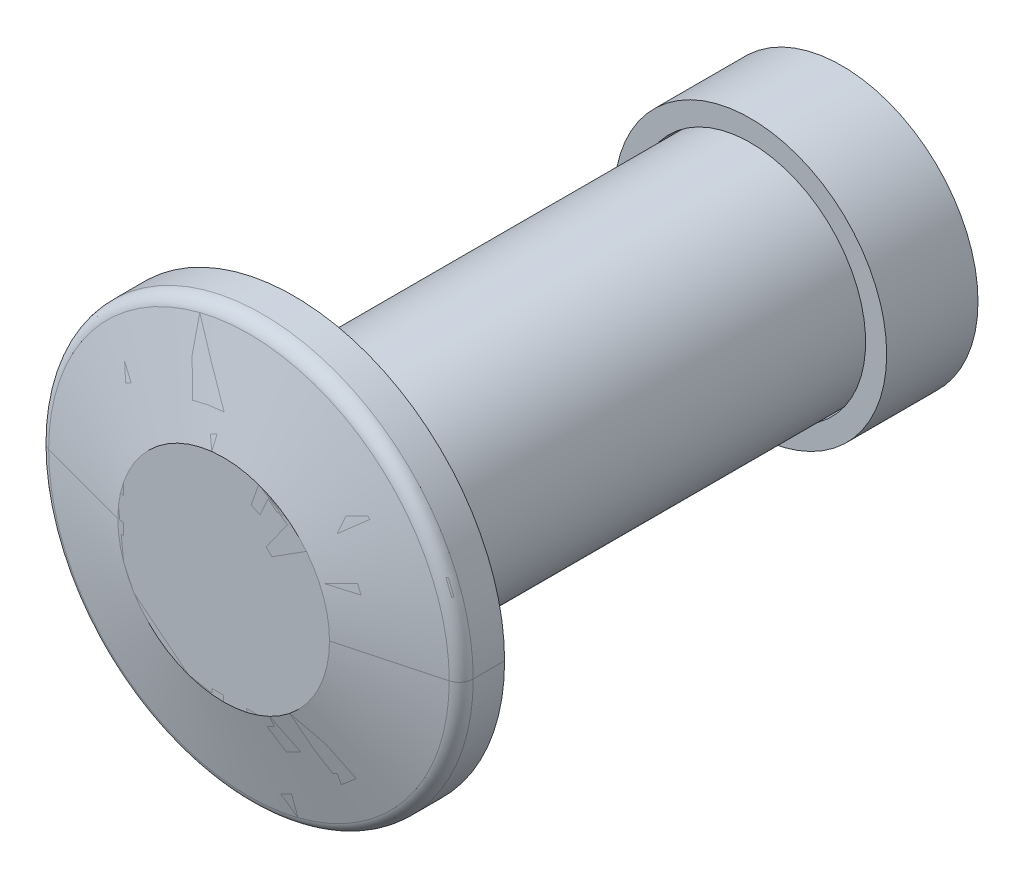
ISO-10303-21;
HEADER;
FILE_DESCRIPTION(('STEP AP214'),'2;1');
FILE_NAME('part.step','',(''),(''),'','','');
FILE_SCHEMA(('AUTOMOTIVE_DESIGN { 1 0 10303 214 1 1 1 1 }'));
ENDSEC;
DATA;
#1=APPLICATION_CONTEXT('core data for automotive mechanical design processes');
#2=APPLICATION_PROTOCOL_DEFINITION('international standard','automotive_design',2000,#1);
#3=PRODUCT_CONTEXT('',#1,'mechanical');
#4=PRODUCT('Part','Part','',(#3));
#5=PRODUCT_RELATED_PRODUCT_CATEGORY('part','',(#4));
#6=PRODUCT_DEFINITION_FORMATION('','',#4);
#7=PRODUCT_DEFINITION_CONTEXT('part definition',#1,'design');
#8=PRODUCT_DEFINITION('design','',#6,#7);
#9=PRODUCT_DEFINITION_SHAPE('','',#8);
#10=(LENGTH_UNIT() NAMED_UNIT(*) SI_UNIT(.MILLI.,.METRE.));
#11=(NAMED_UNIT(*) PLANE_ANGLE_UNIT() SI_UNIT($,.RADIAN.));
#12=(NAMED_UNIT(*) SI_UNIT($,.STERADIAN.) SOLID_ANGLE_UNIT());
#13=UNCERTAINTY_MEASURE_WITH_UNIT(LENGTH_MEASURE(1.E-05),#10,'distance_accuracy_value','');
#14=(GEOMETRIC_REPRESENTATION_CONTEXT(3) GLOBAL_UNCERTAINTY_ASSIGNED_CONTEXT((#13)) GLOBAL_UNIT_ASSIGNED_CONTEXT((#10,
#11,#12)) REPRESENTATION_CONTEXT('',''));
#15=CARTESIAN_POINT('',(0.,0.,0.));
#16=DIRECTION('',(0.,0.,1.));
#17=DIRECTION('',(1.,0.,0.));
#18=AXIS2_PLACEMENT_3D('',#15,#16,#17);
#19=CARTESIAN_POINT('',(0.,0.,-37.5));
#20=DIRECTION('',(0.,0.,-1.));
#21=DIRECTION('',(-1.,0.,0.));
#22=AXIS2_PLACEMENT_3D('',#19,#20,#21);
#23=CYLINDRICAL_SURFACE('',#22,9.7);
#24=CARTESIAN_POINT('',(0.,0.,-37.5));
#25=DIRECTION('',(0.,0.,-1.));
#26=DIRECTION('',(-1.,0.,0.));
#27=AXIS2_PLACEMENT_3D('',#24,#25,#26);
#28=CIRCLE('',#27,9.7);
#29=CARTESIAN_POINT('',(-9.7,0.,-37.5));
#30=VERTEX_POINT('',#29);
#31=EDGE_CURVE('P0_E11',#30,#30,#28,.T.);
#32=ORIENTED_EDGE('',*,*,#31,.T.);
#33=EDGE_LOOP('',(#32));
#34=FACE_BOUND('',#33,.T.);
#35=CARTESIAN_POINT('',(0.,0.,-44.));
#36=DIRECTION('',(0.,0.,-1.));
#37=DIRECTION('',(-1.,0.,0.));
#38=AXIS2_PLACEMENT_3D('',#35,#36,#37);
#39=CIRCLE('',#38,9.7);
#40=CARTESIAN_POINT('',(-9.7,0.,-44.));
#41=VERTEX_POINT('',#40);
#42=EDGE_CURVE('P0_E72',#41,#41,#39,.T.);
#43=ORIENTED_EDGE('',*,*,#42,.F.);
#44=EDGE_LOOP('',(#43));
#45=FACE_BOUND('',#44,.T.);
#46=ADVANCED_FACE('P0_F57',(#34,#45),#23,.T.);
#47=CARTESIAN_POINT('',(0.,0.,-37.5));
#48=DIRECTION('',(0.,0.,-1.));
#49=DIRECTION('',(-1.,0.,0.));
#50=AXIS2_PLACEMENT_3D('',#47,#48,#49);
#51=PLANE('',#50);
#52=CARTESIAN_POINT('',(0.,0.,-37.5));
#53=DIRECTION('',(0.,0.,-1.));
#54=DIRECTION('',(-1.,0.,0.));
#55=AXIS2_PLACEMENT_3D('',#52,#53,#54);
#56=CIRCLE('',#55,8.2);
#57=CARTESIAN_POINT('',(-8.2,0.,-37.5));
#58=VERTEX_POINT('',#57);
#59=EDGE_CURVE('P0_E63',#58,#58,#56,.T.);
#60=ORIENTED_EDGE('',*,*,#59,.T.);
#61=EDGE_LOOP('',(#60));
#62=FACE_BOUND('',#61,.T.);
#63=ORIENTED_EDGE('',*,*,#31,.F.);
#64=EDGE_LOOP('',(#63));
#65=FACE_BOUND('',#64,.T.);
#66=ADVANCED_FACE('P0_F108',(#62,#65),#51,.F.);
#67=CARTESIAN_POINT('',(0.,0.,-37.5));
#68=DIRECTION('',(0.,0.,-1.));
#69=DIRECTION('',(-1.,0.,0.));
#70=AXIS2_PLACEMENT_3D('',#67,#68,#69);
#71=CYLINDRICAL_SURFACE('',#70,8.2);
#72=ORIENTED_EDGE('',*,*,#59,.F.);
#73=EDGE_LOOP('',(#72));
#74=FACE_BOUND('',#73,.T.);
#75=CARTESIAN_POINT('',(0.,0.,-42.5));
#76=DIRECTION('',(0.,0.,-1.));
#77=DIRECTION('',(-1.,0.,0.));
#78=AXIS2_PLACEMENT_3D('',#75,#76,#77);
#79=CIRCLE('',#78,8.2);
#80=CARTESIAN_POINT('',(-8.2,0.,-42.5));
#81=VERTEX_POINT('',#80);
#82=EDGE_CURVE('P0_E67',#81,#81,#79,.T.);
#83=ORIENTED_EDGE('',*,*,#82,.T.);
#84=EDGE_LOOP('',(#83));
#85=FACE_BOUND('',#84,.T.);
#86=ADVANCED_FACE('P0_F112',(#74,#85),#71,.F.);
#87=CARTESIAN_POINT('',(0.,0.,-42.5));
#88=DIRECTION('',(0.,0.,-1.));
#89=DIRECTION('',(-1.,0.,0.));
#90=AXIS2_PLACEMENT_3D('',#87,#88,#89);
#91=PLANE('',#90);
#92=CARTESIAN_POINT('',(0.,0.,-42.5));
#93=DIRECTION('',(0.,0.,-1.));
#94=DIRECTION('',(-1.,0.,0.));
#95=AXIS2_PLACEMENT_3D('',#92,#93,#94);
#96=CIRCLE('',#95,3.6);
#97=CARTESIAN_POINT('',(-3.6,0.,-42.5));
#98=VERTEX_POINT('',#97);
#99=EDGE_CURVE('P0_E80',#98,#98,#96,.T.);
#100=ORIENTED_EDGE('',*,*,#99,.T.);
#101=EDGE_LOOP('',(#100));
#102=FACE_BOUND('',#101,.T.);
#103=CARTESIAN_POINT('',(0.,-5.9,-42.5));
#104=DIRECTION('',(0.,0.,-1.));
#105=DIRECTION('',(-1.,0.,0.));
#106=AXIS2_PLACEMENT_3D('',#103,#104,#105);
#107=CIRCLE('',#106,1.5);
#108=CARTESIAN_POINT('',(-1.5,-5.9,-42.5));
#109=VERTEX_POINT('',#108);
#110=EDGE_CURVE('P0_E76',#109,#109,#107,.T.);
#111=ORIENTED_EDGE('',*,*,#110,.T.);
#112=EDGE_LOOP('',(#111));
#113=FACE_BOUND('',#112,.T.);
#114=ORIENTED_EDGE('',*,*,#82,.F.);
#115=EDGE_LOOP('',(#114));
#116=FACE_BOUND('',#115,.T.);
#117=ADVANCED_FACE('P0_F89',(#102,#113,#116),#91,.F.);
#118=CARTESIAN_POINT('',(0.,0.,-44.));
#119=DIRECTION('',(0.,0.,-1.));
#120=DIRECTION('',(-1.,0.,0.));
#121=AXIS2_PLACEMENT_3D('',#118,#119,#120);
#122=PLANE('',#121);
#123=CARTESIAN_POINT('',(0.,-5.9,-44.));
#124=DIRECTION('',(0.,0.,-1.));
#125=DIRECTION('',(-1.,0.,0.));
#126=AXIS2_PLACEMENT_3D('',#123,#124,#125);
#127=CIRCLE('',#126,1.5);
#128=CARTESIAN_POINT('',(-1.5,-5.9,-44.));
#129=VERTEX_POINT('',#128);
#130=EDGE_CURVE('P0_E83',#129,#129,#127,.T.);
#131=ORIENTED_EDGE('',*,*,#130,.F.);
#132=EDGE_LOOP('',(#131));
#133=FACE_BOUND('',#132,.T.);
#134=CARTESIAN_POINT('',(0.,0.,-44.));
#135=DIRECTION('',(0.,0.,-1.));
#136=DIRECTION('',(-1.,0.,0.));
#137=AXIS2_PLACEMENT_3D('',#134,#135,#136);
#138=CIRCLE('',#137,3.6);
#139=CARTESIAN_POINT('',(-3.6,0.,-44.));
#140=VERTEX_POINT('',#139);
#141=EDGE_CURVE('P0_E77',#140,#140,#138,.T.);
#142=ORIENTED_EDGE('',*,*,#141,.F.);
#143=EDGE_LOOP('',(#142));
#144=FACE_BOUND('',#143,.T.);
#145=ORIENTED_EDGE('',*,*,#42,.T.);
#146=EDGE_LOOP('',(#145));
#147=FACE_BOUND('',#146,.T.);
#148=ADVANCED_FACE('P0_F99',(#133,#144,#147),#122,.T.);
#149=CARTESIAN_POINT('',(0.,0.,-42.5));
#150=DIRECTION('',(0.,0.,-1.));
#151=DIRECTION('',(-1.,0.,0.));
#152=AXIS2_PLACEMENT_3D('',#149,#150,#151);
#153=CYLINDRICAL_SURFACE('',#152,3.6);
#154=ORIENTED_EDGE('',*,*,#99,.F.);
#155=EDGE_LOOP('',(#154));
#156=FACE_BOUND('',#155,.T.);
#157=ORIENTED_EDGE('',*,*,#141,.T.);
#158=EDGE_LOOP('',(#157));
#159=FACE_BOUND('',#158,.T.);
#160=ADVANCED_FACE('P0_F95',(#156,#159),#153,.F.);
#161=CARTESIAN_POINT('',(0.,-5.9,-42.5));
#162=DIRECTION('',(0.,0.,-1.));
#163=DIRECTION('',(-1.,0.,0.));
#164=AXIS2_PLACEMENT_3D('',#161,#162,#163);
#165=CYLINDRICAL_SURFACE('',#164,1.5);
#166=ORIENTED_EDGE('',*,*,#110,.F.);
#167=EDGE_LOOP('',(#166));
#168=FACE_BOUND('',#167,.T.);
#169=ORIENTED_EDGE('',*,*,#130,.T.);
#170=EDGE_LOOP('',(#169));
#171=FACE_BOUND('',#170,.T.);
#172=ADVANCED_FACE('P0_F92',(#168,#171),#165,.F.);
#173=CLOSED_SHELL('',(#46,#66,#86,#117,#148,#160,#172));
#174=MANIFOLD_SOLID_BREP('P0_B2',#173);
#175=CARTESIAN_POINT('',(0.,0.,-42.5));
#176=DIRECTION('',(0.,0.,-1.));
#177=DIRECTION('',(-1.,0.,0.));
#178=AXIS2_PLACEMENT_3D('',#175,#176,#177);
#179=PLANE('',#178);
#180=CARTESIAN_POINT('',(0.,0.,-42.5));
#181=DIRECTION('',(0.,0.,-1.));
#182=DIRECTION('',(-1.,0.,0.));
#183=AXIS2_PLACEMENT_3D('',#180,#181,#182);
#184=CIRCLE('',#183,8.1);
#185=CARTESIAN_POINT('',(-8.1,0.,-42.5));
#186=VERTEX_POINT('',#185);
#187=EDGE_CURVE('P0_E56',#186,#186,#184,.T.);
#188=ORIENTED_EDGE('',*,*,#187,.T.);
#189=EDGE_LOOP('',(#188));
#190=FACE_BOUND('',#189,.T.);
#191=CARTESIAN_POINT('',(0.,0.,-42.5));
#192=DIRECTION('',(0.,0.,-1.));
#193=DIRECTION('',(-1.,0.,0.));
#194=AXIS2_PLACEMENT_3D('',#191,#192,#193);
#195=CIRCLE('',#194,7.1);
#196=CARTESIAN_POINT('',(-7.1,0.,-42.5));
#197=VERTEX_POINT('',#196);
#198=EDGE_CURVE('P0_E192',#197,#197,#195,.T.);
#199=ORIENTED_EDGE('',*,*,#198,.F.);
#200=EDGE_LOOP('',(#199));
#201=FACE_BOUND('',#200,.T.);
#202=ADVANCED_FACE('P0_F181',(#190,#201),#179,.T.);
#203=CARTESIAN_POINT('',(0.,0.,-2.5));
#204=DIRECTION('',(0.,0.,-1.));
#205=DIRECTION('',(-1.,0.,0.));
#206=AXIS2_PLACEMENT_3D('',#203,#204,#205);
#207=PLANE('',#206);
#208=CARTESIAN_POINT('',(0.,0.,-2.5));
#209=DIRECTION('',(0.,0.,-1.));
#210=DIRECTION('',(-1.,0.,0.));
#211=AXIS2_PLACEMENT_3D('',#208,#209,#210);
#212=CIRCLE('',#211,8.1);
#213=CARTESIAN_POINT('',(-8.1,0.,-2.5));
#214=VERTEX_POINT('',#213);
#215=EDGE_CURVE('P0_E185',#214,#214,#212,.T.);
#216=ORIENTED_EDGE('',*,*,#215,.F.);
#217=EDGE_LOOP('',(#216));
#218=FACE_BOUND('',#217,.T.);
#219=CARTESIAN_POINT('',(0.,0.,-2.5));
#220=DIRECTION('',(0.,0.,-1.));
#221=DIRECTION('',(-1.,0.,0.));
#222=AXIS2_PLACEMENT_3D('',#219,#220,#221);
#223=CIRCLE('',#222,7.1);
#224=CARTESIAN_POINT('',(-7.1,0.,-2.5));
#225=VERTEX_POINT('',#224);
#226=EDGE_CURVE('P0_E194',#225,#225,#223,.T.);
#227=ORIENTED_EDGE('',*,*,#226,.T.);
#228=EDGE_LOOP('',(#227));
#229=FACE_BOUND('',#228,.T.);
#230=ADVANCED_FACE('P0_F203',(#218,#229),#207,.F.);
#231=CARTESIAN_POINT('',(0.,0.,-42.5));
#232=DIRECTION('',(0.,0.,1.));
#233=DIRECTION('',(1.,0.,0.));
#234=AXIS2_PLACEMENT_3D('',#231,#232,#233);
#235=CYLINDRICAL_SURFACE('',#234,8.1);
#236=ORIENTED_EDGE('',*,*,#215,.T.);
#237=EDGE_LOOP('',(#236));
#238=FACE_BOUND('',#237,.T.);
#239=ORIENTED_EDGE('',*,*,#187,.F.);
#240=EDGE_LOOP('',(#239));
#241=FACE_BOUND('',#240,.T.);
#242=ADVANCED_FACE('P0_F183',(#238,#241),#235,.T.);
#243=CARTESIAN_POINT('',(0.,0.,-42.5));
#244=DIRECTION('',(0.,0.,1.));
#245=DIRECTION('',(1.,0.,0.));
#246=AXIS2_PLACEMENT_3D('',#243,#244,#245);
#247=CYLINDRICAL_SURFACE('',#246,7.1);
#248=ORIENTED_EDGE('',*,*,#226,.F.);
#249=EDGE_LOOP('',(#248));
#250=FACE_BOUND('',#249,.T.);
#251=ORIENTED_EDGE('',*,*,#198,.T.);
#252=EDGE_LOOP('',(#251));
#253=FACE_BOUND('',#252,.T.);
#254=ADVANCED_FACE('P0_F200',(#250,#253),#247,.F.);
#255=CLOSED_SHELL('',(#202,#230,#242,#254));
#256=MANIFOLD_SOLID_BREP('P0_B6',#255);
#257=CARTESIAN_POINT('',(0.,0.,-2.76756770947729));
#258=DIRECTION('',(0.,0.,-1.));
#259=DIRECTION('',(-1.,0.,0.));
#260=AXIS2_PLACEMENT_3D('',#257,#258,#259);
#261=TOROIDAL_SURFACE('',#260,14.,1.);
#262=CARTESIAN_POINT('',(0.,0.,-1.80164188318823));
#263=DIRECTION('',(0.,0.,-1.));
#264=DIRECTION('',(-1.,0.,0.));
#265=AXIS2_PLACEMENT_3D('',#262,#263,#264);
#266=CIRCLE('',#265,14.2588190451025);
#267=CARTESIAN_POINT('',(-14.2588190451025,0.,-1.80164188318823));
#268=VERTEX_POINT('',#267);
#269=CARTESIAN_POINT('',(14.2588190451025,0.,-1.80164188318823));
#270=VERTEX_POINT('',#269);
#271=EDGE_CURVE('P0_E179',#268,#270,#266,.T.);
#272=ORIENTED_EDGE('',*,*,#271,.T.);
#273=CARTESIAN_POINT('',(14.,0.,-2.76756770947729));
#274=DIRECTION('',(0.,1.,0.));
#275=DIRECTION('',(-1.,0.,0.));
#276=AXIS2_PLACEMENT_3D('',#273,#274,#275);
#277=CIRCLE('',#276,1.);
#278=CARTESIAN_POINT('',(15.,0.,-2.76756770947731));
#279=VERTEX_POINT('',#278);
#280=EDGE_CURVE('P0_E259',#270,#279,#277,.T.);
#281=ORIENTED_EDGE('',*,*,#280,.T.);
#282=CARTESIAN_POINT('',(0.,0.,-2.76756770947731));
#283=DIRECTION('',(0.,0.,-1.));
#284=DIRECTION('',(-1.,0.,0.));
#285=AXIS2_PLACEMENT_3D('',#282,#283,#284);
#286=CIRCLE('',#285,15.);
#287=CARTESIAN_POINT('',(-15.,0.,-2.76756770947731));
#288=VERTEX_POINT('',#287);
#289=EDGE_CURVE('P0_E343',#288,#279,#286,.T.);
#290=ORIENTED_EDGE('',*,*,#289,.F.);
#291=CARTESIAN_POINT('',(-14.,0.,-2.76756770947729));
#292=DIRECTION('',(0.,-1.,0.));
#293=DIRECTION('',(0.,0.,-1.));
#294=AXIS2_PLACEMENT_3D('',#291,#292,#293);
#295=CIRCLE('',#294,1.);
#296=EDGE_CURVE('P0_E386',#268,#288,#295,.T.);
#297=ORIENTED_EDGE('',*,*,#296,.F.);
#298=EDGE_LOOP('',(#272,#281,#290,#297));
#299=FACE_BOUND('',#298,.T.);
#300=ADVANCED_FACE('P0_F248',(#299),#261,.T.);
#301=CARTESIAN_POINT('',(0.,0.,0.));
#302=DIRECTION('',(0.,0.,-1.));
#303=DIRECTION('',(-1.,0.,0.));
#304=AXIS2_PLACEMENT_3D('',#301,#302,#303);
#305=CONICAL_SURFACE('',#304,7.535,1.30899693899575);
#306=CARTESIAN_POINT('',(0.,0.,0.));
#307=DIRECTION('',(0.,0.,-1.));
#308=DIRECTION('',(-1.,0.,0.));
#309=AXIS2_PLACEMENT_3D('',#306,#307,#308);
#310=CIRCLE('',#309,7.535);
#311=CARTESIAN_POINT('',(-7.535,0.,0.));
#312=VERTEX_POINT('',#311);
#313=CARTESIAN_POINT('',(7.535,0.,0.));
#314=VERTEX_POINT('',#313);
#315=EDGE_CURVE('P0_E389',#312,#314,#310,.T.);
#316=ORIENTED_EDGE('',*,*,#315,.T.);
#317=DIRECTION('',(0.965925826289068,0.,-0.258819045102522));
#318=VECTOR('',#317,1.);
#319=CARTESIAN_POINT('',(7.535,0.,0.));
#320=LINE('',#319,#318);
#321=EDGE_CURVE('P0_E272',#314,#270,#320,.T.);
#322=ORIENTED_EDGE('',*,*,#321,.T.);
#323=ORIENTED_EDGE('',*,*,#271,.F.);
#324=DIRECTION('',(-0.965925826289068,0.,-0.258819045102522));
#325=VECTOR('',#324,1.);
#326=CARTESIAN_POINT('',(-7.535,0.,0.));
#327=LINE('',#326,#325);
#328=EDGE_CURVE('P0_E373',#312,#268,#327,.T.);
#329=ORIENTED_EDGE('',*,*,#328,.F.);
#330=EDGE_LOOP('',(#316,#322,#323,#329));
#331=FACE_BOUND('',#330,.T.);
#332=ADVANCED_FACE('P0_F468',(#331),#305,.T.);
#333=CARTESIAN_POINT('',(0.,0.,-2.8));
#334=DIRECTION('',(0.,0.,-1.));
#335=DIRECTION('',(-1.,0.,0.));
#336=AXIS2_PLACEMENT_3D('',#333,#334,#335);
#337=TOROIDAL_SURFACE('',#336,8.3,0.3);
#338=CARTESIAN_POINT('',(0.,0.,-2.5));
#339=DIRECTION('',(0.,0.,-1.));
#340=DIRECTION('',(-1.,0.,0.));
#341=AXIS2_PLACEMENT_3D('',#338,#339,#340);
#342=CIRCLE('',#341,8.3);
#343=CARTESIAN_POINT('',(8.3,0.,-2.5));
#344=VERTEX_POINT('',#343);
#345=CARTESIAN_POINT('',(-8.3,0.,-2.5));
#346=VERTEX_POINT('',#345);
#347=EDGE_CURVE('P0_E310',#344,#346,#342,.T.);
#348=ORIENTED_EDGE('',*,*,#347,.F.);
#349=CARTESIAN_POINT('',(8.3,0.,-2.8));
#350=DIRECTION('',(0.,1.,0.));
#351=DIRECTION('',(-1.,0.,0.));
#352=AXIS2_PLACEMENT_3D('',#349,#350,#351);
#353=CIRCLE('',#352,0.3);
#354=CARTESIAN_POINT('',(8.6,0.,-2.8));
#355=VERTEX_POINT('',#354);
#356=EDGE_CURVE('P0_E393',#344,#355,#353,.T.);
#357=ORIENTED_EDGE('',*,*,#356,.T.);
#358=CARTESIAN_POINT('',(0.,0.,-2.8));
#359=DIRECTION('',(0.,0.,-1.));
#360=DIRECTION('',(-1.,0.,0.));
#361=AXIS2_PLACEMENT_3D('',#358,#359,#360);
#362=CIRCLE('',#361,8.6);
#363=CARTESIAN_POINT('',(-8.6,0.,-2.8));
#364=VERTEX_POINT('',#363);
#365=EDGE_CURVE('P0_E367',#355,#364,#362,.T.);
#366=ORIENTED_EDGE('',*,*,#365,.T.);
#367=CARTESIAN_POINT('',(-8.3,0.,-2.8));
#368=DIRECTION('',(0.,-1.,0.));
#369=DIRECTION('',(0.,0.,-1.));
#370=AXIS2_PLACEMENT_3D('',#367,#368,#369);
#371=CIRCLE('',#370,0.3);
#372=EDGE_CURVE('P0_E299',#346,#364,#371,.T.);
#373=ORIENTED_EDGE('',*,*,#372,.F.);
#374=EDGE_LOOP('',(#348,#357,#366,#373));
#375=FACE_BOUND('',#374,.T.);
#376=ADVANCED_FACE('P0_F417',(#375),#337,.F.);
#377=CARTESIAN_POINT('',(0.,0.,0.));
#378=DIRECTION('',(0.,0.,-1.));
#379=DIRECTION('',(-1.,0.,0.));
#380=AXIS2_PLACEMENT_3D('',#377,#378,#379);
#381=CYLINDRICAL_SURFACE('',#380,8.6);
#382=ORIENTED_EDGE('',*,*,#365,.F.);
#383=DIRECTION('',(0.,0.,-1.));
#384=VECTOR('',#383,1.);
#385=CARTESIAN_POINT('',(8.6,0.,0.));
#386=LINE('',#385,#384);
#387=CARTESIAN_POINT('',(8.6,0.,-5.));
#388=VERTEX_POINT('',#387);
#389=EDGE_CURVE('P0_E364',#355,#388,#386,.T.);
#390=ORIENTED_EDGE('',*,*,#389,.T.);
#391=CARTESIAN_POINT('',(0.,0.,-5.));
#392=DIRECTION('',(0.,0.,-1.));
#393=DIRECTION('',(-1.,0.,0.));
#394=AXIS2_PLACEMENT_3D('',#391,#392,#393);
#395=CIRCLE('',#394,8.6);
#396=CARTESIAN_POINT('',(-8.6,0.,-5.));
#397=VERTEX_POINT('',#396);
#398=EDGE_CURVE('P0_E363',#388,#397,#395,.T.);
#399=ORIENTED_EDGE('',*,*,#398,.T.);
#400=DIRECTION('',(0.,0.,-1.));
#401=VECTOR('',#400,1.);
#402=CARTESIAN_POINT('',(-8.6,0.,0.));
#403=LINE('',#402,#401);
#404=EDGE_CURVE('P0_E352',#364,#397,#403,.T.);
#405=ORIENTED_EDGE('',*,*,#404,.F.);
#406=EDGE_LOOP('',(#382,#390,#399,#405));
#407=FACE_BOUND('',#406,.T.);
#408=ADVANCED_FACE('P0_F250',(#407),#381,.F.);
#409=CARTESIAN_POINT('',(0.,0.,0.));
#410=DIRECTION('',(0.,0.,-1.));
#411=DIRECTION('',(-1.,0.,0.));
#412=AXIS2_PLACEMENT_3D('',#409,#410,#411);
#413=CYLINDRICAL_SURFACE('',#412,15.);
#414=ORIENTED_EDGE('',*,*,#289,.T.);
#415=DIRECTION('',(0.,0.,-1.));
#416=VECTOR('',#415,1.);
#417=CARTESIAN_POINT('',(15.,0.,0.));
#418=LINE('',#417,#416);
#419=CARTESIAN_POINT('',(15.,0.,-5.));
#420=VERTEX_POINT('',#419);
#421=EDGE_CURVE('P0_E340',#279,#420,#418,.T.);
#422=ORIENTED_EDGE('',*,*,#421,.T.);
#423=CARTESIAN_POINT('',(0.,0.,-5.));
#424=DIRECTION('',(0.,0.,-1.));
#425=DIRECTION('',(-1.,0.,0.));
#426=AXIS2_PLACEMENT_3D('',#423,#424,#425);
#427=CIRCLE('',#426,15.);
#428=CARTESIAN_POINT('',(-15.,0.,-5.));
#429=VERTEX_POINT('',#428);
#430=EDGE_CURVE('P0_E326',#429,#420,#427,.T.);
#431=ORIENTED_EDGE('',*,*,#430,.F.);
#432=DIRECTION('',(0.,0.,-1.));
#433=VECTOR('',#432,1.);
#434=CARTESIAN_POINT('',(-15.,0.,0.));
#435=LINE('',#434,#433);
#436=EDGE_CURVE('P0_E337',#288,#429,#435,.T.);
#437=ORIENTED_EDGE('',*,*,#436,.F.);
#438=EDGE_LOOP('',(#414,#422,#431,#437));
#439=FACE_BOUND('',#438,.T.);
#440=ADVANCED_FACE('P0_F341',(#439),#413,.T.);
#441=CARTESIAN_POINT('',(0.,0.,0.));
#442=DIRECTION('',(0.,0.,-1.));
#443=DIRECTION('',(-1.,0.,0.));
#444=AXIS2_PLACEMENT_3D('',#441,#442,#443);
#445=CYLINDRICAL_SURFACE('',#444,15.);
#446=ORIENTED_EDGE('',*,*,#421,.F.);
#447=CARTESIAN_POINT('',(0.,0.,-2.76756770947731));
#448=DIRECTION('',(0.,0.,-1.));
#449=DIRECTION('',(-1.,0.,0.));
#450=AXIS2_PLACEMENT_3D('',#447,#448,#449);
#451=CIRCLE('',#450,15.);
#452=EDGE_CURVE('P0_E348',#279,#288,#451,.T.);
#453=ORIENTED_EDGE('',*,*,#452,.T.);
#454=ORIENTED_EDGE('',*,*,#436,.T.);
#455=CARTESIAN_POINT('',(0.,0.,-5.));
#456=DIRECTION('',(0.,0.,-1.));
#457=DIRECTION('',(-1.,0.,0.));
#458=AXIS2_PLACEMENT_3D('',#455,#456,#457);
#459=CIRCLE('',#458,15.);
#460=EDGE_CURVE('P0_E335',#420,#429,#459,.T.);
#461=ORIENTED_EDGE('',*,*,#460,.F.);
#462=EDGE_LOOP('',(#446,#453,#454,#461));
#463=FACE_BOUND('',#462,.T.);
#464=ADVANCED_FACE('P0_F350',(#463),#445,.T.);
#465=CARTESIAN_POINT('',(8.6,0.,-5.));
#466=DIRECTION('',(0.,0.,1.));
#467=DIRECTION('',(1.,0.,0.));
#468=AXIS2_PLACEMENT_3D('',#465,#466,#467);
#469=PLANE('',#468);
#470=ORIENTED_EDGE('',*,*,#430,.T.);
#471=ORIENTED_EDGE('',*,*,#460,.T.);
#472=EDGE_LOOP('',(#470,#471));
#473=FACE_BOUND('',#472,.T.);
#474=CARTESIAN_POINT('',(0.,0.,-5.));
#475=DIRECTION('',(0.,0.,-1.));
#476=DIRECTION('',(-1.,0.,0.));
#477=AXIS2_PLACEMENT_3D('',#474,#475,#476);
#478=CIRCLE('',#477,8.6);
#479=EDGE_CURVE('P0_E252',#397,#388,#478,.T.);
#480=ORIENTED_EDGE('',*,*,#479,.F.);
#481=ORIENTED_EDGE('',*,*,#398,.F.);
#482=EDGE_LOOP('',(#480,#481));
#483=FACE_BOUND('',#482,.T.);
#484=ADVANCED_FACE('P0_F332',(#473,#483),#469,.F.);
#485=CARTESIAN_POINT('',(0.,0.,0.));
#486=DIRECTION('',(0.,0.,-1.));
#487=DIRECTION('',(-1.,0.,0.));
#488=AXIS2_PLACEMENT_3D('',#485,#486,#487);
#489=CYLINDRICAL_SURFACE('',#488,8.6);
#490=ORIENTED_EDGE('',*,*,#389,.F.);
#491=CARTESIAN_POINT('',(0.,0.,-2.8));
#492=DIRECTION('',(0.,0.,-1.));
#493=DIRECTION('',(-1.,0.,0.));
#494=AXIS2_PLACEMENT_3D('',#491,#492,#493);
#495=CIRCLE('',#494,8.6);
#496=EDGE_CURVE('P0_E369',#364,#355,#495,.T.);
#497=ORIENTED_EDGE('',*,*,#496,.F.);
#498=ORIENTED_EDGE('',*,*,#404,.T.);
#499=ORIENTED_EDGE('',*,*,#479,.T.);
#500=EDGE_LOOP('',(#490,#497,#498,#499));
#501=FACE_BOUND('',#500,.T.);
#502=ADVANCED_FACE('P0_F422',(#501),#489,.F.);
#503=CARTESIAN_POINT('',(0.,0.,-2.8));
#504=DIRECTION('',(0.,0.,-1.));
#505=DIRECTION('',(-1.,0.,0.));
#506=AXIS2_PLACEMENT_3D('',#503,#504,#505);
#507=TOROIDAL_SURFACE('',#506,8.3,0.3);
#508=ORIENTED_EDGE('',*,*,#356,.F.);
#509=CARTESIAN_POINT('',(0.,0.,-2.5));
#510=DIRECTION('',(0.,0.,-1.));
#511=DIRECTION('',(-1.,0.,0.));
#512=AXIS2_PLACEMENT_3D('',#509,#510,#511);
#513=CIRCLE('',#512,8.3);
#514=EDGE_CURVE('P0_E372',#346,#344,#513,.T.);
#515=ORIENTED_EDGE('',*,*,#514,.F.);
#516=ORIENTED_EDGE('',*,*,#372,.T.);
#517=ORIENTED_EDGE('',*,*,#496,.T.);
#518=EDGE_LOOP('',(#508,#515,#516,#517));
#519=FACE_BOUND('',#518,.T.);
#520=ADVANCED_FACE('P0_F420',(#519),#507,.F.);
#521=CARTESIAN_POINT('',(8.3,0.,-2.5));
#522=DIRECTION('',(0.,0.,1.));
#523=DIRECTION('',(1.,0.,0.));
#524=AXIS2_PLACEMENT_3D('',#521,#522,#523);
#525=PLANE('',#524);
#526=CARTESIAN_POINT('',(0.,0.,-2.5));
#527=DIRECTION('',(0.,0.,1.));
#528=DIRECTION('',(1.,0.,0.));
#529=AXIS2_PLACEMENT_3D('',#526,#527,#528);
#530=CIRCLE('',#529,4.65);
#531=CARTESIAN_POINT('',(4.65,0.,-2.5));
#532=VERTEX_POINT('',#531);
#533=EDGE_CURVE('P0_E358',#532,#532,#530,.T.);
#534=ORIENTED_EDGE('',*,*,#533,.T.);
#535=EDGE_LOOP('',(#534));
#536=FACE_BOUND('',#535,.T.);
#537=ORIENTED_EDGE('',*,*,#514,.T.);
#538=ORIENTED_EDGE('',*,*,#347,.T.);
#539=EDGE_LOOP('',(#537,#538));
#540=FACE_BOUND('',#539,.T.);
#541=ADVANCED_FACE('P0_F428',(#536,#540),#525,.F.);
#542=CARTESIAN_POINT('',(7.535,0.,0.));
#543=DIRECTION('',(0.,0.,-1.));
#544=DIRECTION('',(0.,-1.,0.));
#545=AXIS2_PLACEMENT_3D('',#542,#543,#544);
#546=PLANE('',#545);
#547=CARTESIAN_POINT('',(0.,0.,0.));
#548=DIRECTION('',(0.,0.,1.));
#549=DIRECTION('',(1.,0.,0.));
#550=AXIS2_PLACEMENT_3D('',#547,#548,#549);
#551=CIRCLE('',#550,4.65);
#552=CARTESIAN_POINT('',(4.65,0.,0.));
#553=VERTEX_POINT('',#552);
#554=EDGE_CURVE('P0_E595',#553,#553,#551,.T.);
#555=ORIENTED_EDGE('',*,*,#554,.F.);
#556=EDGE_LOOP('',(#555));
#557=FACE_BOUND('',#556,.T.);
#558=ORIENTED_EDGE('',*,*,#315,.F.);
#559=CARTESIAN_POINT('',(0.,0.,0.));
#560=DIRECTION('',(0.,0.,-1.));
#561=DIRECTION('',(-1.,0.,0.));
#562=AXIS2_PLACEMENT_3D('',#559,#560,#561);
#563=CIRCLE('',#562,7.535);
#564=EDGE_CURVE('P0_E377',#314,#312,#563,.T.);
#565=ORIENTED_EDGE('',*,*,#564,.F.);
#566=EDGE_LOOP('',(#558,#565));
#567=FACE_BOUND('',#566,.T.);
#568=ADVANCED_FACE('P0_F433',(#557,#567),#546,.F.);
#569=CARTESIAN_POINT('',(0.,0.,0.));
#570=DIRECTION('',(0.,0.,-1.));
#571=DIRECTION('',(-1.,0.,0.));
#572=AXIS2_PLACEMENT_3D('',#569,#570,#571);
#573=CONICAL_SURFACE('',#572,7.535,1.30899693899575);
#574=ORIENTED_EDGE('',*,*,#321,.F.);
#575=ORIENTED_EDGE('',*,*,#564,.T.);
#576=ORIENTED_EDGE('',*,*,#328,.T.);
#577=CARTESIAN_POINT('',(0.,0.,-1.80164188318823));
#578=DIRECTION('',(0.,0.,-1.));
#579=DIRECTION('',(-1.,0.,0.));
#580=AXIS2_PLACEMENT_3D('',#577,#578,#579);
#581=CIRCLE('',#580,14.2588190451025);
#582=EDGE_CURVE('P0_E378',#270,#268,#581,.T.);
#583=ORIENTED_EDGE('',*,*,#582,.F.);
#584=EDGE_LOOP('',(#574,#575,#576,#583));
#585=FACE_BOUND('',#584,.T.);
#586=ADVANCED_FACE('P0_F452',(#585),#573,.T.);
#587=CARTESIAN_POINT('',(0.,0.,-2.76756770947729));
#588=DIRECTION('',(0.,0.,-1.));
#589=DIRECTION('',(-1.,0.,0.));
#590=AXIS2_PLACEMENT_3D('',#587,#588,#589);
#591=TOROIDAL_SURFACE('',#590,14.,1.);
#592=ORIENTED_EDGE('',*,*,#280,.F.);
#593=ORIENTED_EDGE('',*,*,#582,.T.);
#594=ORIENTED_EDGE('',*,*,#296,.T.);
#595=ORIENTED_EDGE('',*,*,#452,.F.);
#596=EDGE_LOOP('',(#592,#593,#594,#595));
#597=FACE_BOUND('',#596,.T.);
#598=ADVANCED_FACE('P0_F447',(#597),#591,.T.);
#599=CARTESIAN_POINT('',(0.,0.,-5.));
#600=DIRECTION('',(0.,0.,1.));
#601=DIRECTION('',(1.,0.,0.));
#602=AXIS2_PLACEMENT_3D('',#599,#600,#601);
#603=CYLINDRICAL_SURFACE('',#602,4.65);
#604=ORIENTED_EDGE('',*,*,#554,.T.);
#605=EDGE_LOOP('',(#604));
#606=FACE_BOUND('',#605,.T.);
#607=ORIENTED_EDGE('',*,*,#533,.F.);
#608=EDGE_LOOP('',(#607));
#609=FACE_BOUND('',#608,.T.);
#610=ADVANCED_FACE('P0_F451',(#606,#609),#603,.F.);
#611=CLOSED_SHELL('',(#300,#332,#376,#408,#440,#464,#484,#502,#520,#541,#568,#586,#598,#610));
#612=MANIFOLD_SOLID_BREP('P0_B51',#611);
#613=CARTESIAN_POINT('',(0.,0.,-2.76756770947729));
#614=DIRECTION('',(0.,0.,-1.));
#615=DIRECTION('',(-1.,0.,0.));
#616=AXIS2_PLACEMENT_3D('',#613,#614,#615);
#617=TOROIDAL_SURFACE('',#616,14.,1.);
#618=CARTESIAN_POINT('',(0.,0.,-1.80164188318823));
#619=DIRECTION('',(0.,0.,-1.));
#620=DIRECTION('',(-1.,0.,0.));
#621=AXIS2_PLACEMENT_3D('',#618,#619,#620);
#622=CIRCLE('',#621,14.2588190451025);
#623=CARTESIAN_POINT('',(-14.2588190451025,0.,-1.80164188318823));
#624=VERTEX_POINT('',#623);
#625=CARTESIAN_POINT('',(14.2588190451025,0.,-1.80164188318823));
#626=VERTEX_POINT('',#625);
#627=EDGE_CURVE('P1_E11',#624,#626,#622,.T.);
#628=ORIENTED_EDGE('',*,*,#627,.T.);
#629=CARTESIAN_POINT('',(14.,0.,-2.76756770947729));
#630=DIRECTION('',(0.,1.,0.));
#631=DIRECTION('',(-1.,0.,0.));
#632=AXIS2_PLACEMENT_3D('',#629,#630,#631);
#633=CIRCLE('',#632,1.);
#634=CARTESIAN_POINT('',(15.,0.,-2.76756770947731));
#635=VERTEX_POINT('',#634);
#636=EDGE_CURVE('P1_E27',#626,#635,#633,.T.);
#637=ORIENTED_EDGE('',*,*,#636,.T.);
#638=CARTESIAN_POINT('',(0.,0.,-2.76756770947731));
#639=DIRECTION('',(0.,0.,-1.));
#640=DIRECTION('',(-1.,0.,0.));
#641=AXIS2_PLACEMENT_3D('',#638,#639,#640);
#642=CIRCLE('',#641,15.);
#643=CARTESIAN_POINT('',(-15.,0.,-2.76756770947731));
#644=VERTEX_POINT('',#643);
#645=EDGE_CURVE('P1_E117',#644,#635,#642,.T.);
#646=ORIENTED_EDGE('',*,*,#645,.F.);
#647=CARTESIAN_POINT('',(-14.,0.,-2.76756770947729));
#648=DIRECTION('',(0.,-1.,0.));
#649=DIRECTION('',(0.,0.,-1.));
#650=AXIS2_PLACEMENT_3D('',#647,#648,#649);
#651=CIRCLE('',#650,1.);
#652=EDGE_CURVE('P1_E158',#624,#644,#651,.T.);
#653=ORIENTED_EDGE('',*,*,#652,.F.);
#654=EDGE_LOOP('',(#628,#637,#646,#653));
#655=FACE_BOUND('',#654,.T.);
#656=ADVANCED_FACE('P1_F16',(#655),#617,.T.);
#657=CARTESIAN_POINT('',(0.,0.,0.));
#658=DIRECTION('',(0.,0.,-1.));
#659=DIRECTION('',(-1.,0.,0.));
#660=AXIS2_PLACEMENT_3D('',#657,#658,#659);
#661=CONICAL_SURFACE('',#660,7.535,1.30899693899575);
#662=CARTESIAN_POINT('',(0.,0.,0.));
#663=DIRECTION('',(0.,0.,-1.));
#664=DIRECTION('',(-1.,0.,0.));
#665=AXIS2_PLACEMENT_3D('',#662,#663,#664);
#666=CIRCLE('',#665,7.535);
#667=CARTESIAN_POINT('',(-7.535,0.,0.));
#668=VERTEX_POINT('',#667);
#669=CARTESIAN_POINT('',(7.535,0.,0.));
#670=VERTEX_POINT('',#669);
#671=EDGE_CURVE('P1_E161',#668,#670,#666,.T.);
#672=ORIENTED_EDGE('',*,*,#671,.T.);
#673=DIRECTION('',(0.965925826289068,0.,-0.258819045102522));
#674=VECTOR('',#673,1.);
#675=CARTESIAN_POINT('',(7.535,0.,0.));
#676=LINE('',#675,#674);
#677=EDGE_CURVE('P1_E42',#670,#626,#676,.T.);
#678=ORIENTED_EDGE('',*,*,#677,.T.);
#679=ORIENTED_EDGE('',*,*,#627,.F.);
#680=DIRECTION('',(-0.965925826289068,0.,-0.258819045102522));
#681=VECTOR('',#680,1.);
#682=CARTESIAN_POINT('',(-7.535,0.,0.));
#683=LINE('',#682,#681);
#684=EDGE_CURVE('P1_E145',#668,#624,#683,.T.);
#685=ORIENTED_EDGE('',*,*,#684,.F.);
#686=EDGE_LOOP('',(#672,#678,#679,#685));
#687=FACE_BOUND('',#686,.T.);
#688=ADVANCED_FACE('P1_F258',(#687),#661,.T.);
#689=CARTESIAN_POINT('',(0.,0.,-2.8));
#690=DIRECTION('',(0.,0.,-1.));
#691=DIRECTION('',(-1.,0.,0.));
#692=AXIS2_PLACEMENT_3D('',#689,#690,#691);
#693=TOROIDAL_SURFACE('',#692,8.3,0.3);
#694=CARTESIAN_POINT('',(0.,0.,-2.5));
#695=DIRECTION('',(0.,0.,-1.));
#696=DIRECTION('',(-1.,0.,0.));
#697=AXIS2_PLACEMENT_3D('',#694,#695,#696);
#698=CIRCLE('',#697,8.3);
#699=CARTESIAN_POINT('',(8.3,0.,-2.5));
#700=VERTEX_POINT('',#699);
#701=CARTESIAN_POINT('',(-8.3,0.,-2.5));
#702=VERTEX_POINT('',#701);
#703=EDGE_CURVE('P1_E82',#700,#702,#698,.T.);
#704=ORIENTED_EDGE('',*,*,#703,.F.);
#705=CARTESIAN_POINT('',(8.3,0.,-2.8));
#706=DIRECTION('',(0.,1.,0.));
#707=DIRECTION('',(-1.,0.,0.));
#708=AXIS2_PLACEMENT_3D('',#705,#706,#707);
#709=CIRCLE('',#708,0.3);
#710=CARTESIAN_POINT('',(8.6,0.,-2.8));
#711=VERTEX_POINT('',#710);
#712=EDGE_CURVE('P1_E165',#700,#711,#709,.T.);
#713=ORIENTED_EDGE('',*,*,#712,.T.);
#714=CARTESIAN_POINT('',(0.,0.,-2.8));
#715=DIRECTION('',(0.,0.,-1.));
#716=DIRECTION('',(-1.,0.,0.));
#717=AXIS2_PLACEMENT_3D('',#714,#715,#716);
#718=CIRCLE('',#717,8.6);
#719=CARTESIAN_POINT('',(-8.6,0.,-2.8));
#720=VERTEX_POINT('',#719);
#721=EDGE_CURVE('P1_E139',#711,#720,#718,.T.);
#722=ORIENTED_EDGE('',*,*,#721,.T.);
#723=CARTESIAN_POINT('',(-8.3,0.,-2.8));
#724=DIRECTION('',(0.,-1.,0.));
#725=DIRECTION('',(0.,0.,-1.));
#726=AXIS2_PLACEMENT_3D('',#723,#724,#725);
#727=CIRCLE('',#726,0.3);
#728=EDGE_CURVE('P1_E70',#702,#720,#727,.T.);
#729=ORIENTED_EDGE('',*,*,#728,.F.);
#730=EDGE_LOOP('',(#704,#713,#722,#729));
#731=FACE_BOUND('',#730,.T.);
#732=ADVANCED_FACE('P1_F190',(#731),#693,.F.);
#733=CARTESIAN_POINT('',(0.,0.,0.));
#734=DIRECTION('',(0.,0.,-1.));
#735=DIRECTION('',(-1.,0.,0.));
#736=AXIS2_PLACEMENT_3D('',#733,#734,#735);
#737=CYLINDRICAL_SURFACE('',#736,8.6);
#738=ORIENTED_EDGE('',*,*,#721,.F.);
#739=DIRECTION('',(0.,0.,-1.));
#740=VECTOR('',#739,1.);
#741=CARTESIAN_POINT('',(8.6,0.,0.));
#742=LINE('',#741,#740);
#743=CARTESIAN_POINT('',(8.6,0.,-5.));
#744=VERTEX_POINT('',#743);
#745=EDGE_CURVE('P1_E136',#711,#744,#742,.T.);
#746=ORIENTED_EDGE('',*,*,#745,.T.);
#747=CARTESIAN_POINT('',(0.,0.,-5.));
#748=DIRECTION('',(0.,0.,-1.));
#749=DIRECTION('',(-1.,0.,0.));
#750=AXIS2_PLACEMENT_3D('',#747,#748,#749);
#751=CIRCLE('',#750,8.6);
#752=CARTESIAN_POINT('',(-8.6,0.,-5.));
#753=VERTEX_POINT('',#752);
#754=EDGE_CURVE('P1_E135',#744,#753,#751,.T.);
#755=ORIENTED_EDGE('',*,*,#754,.T.);
#756=DIRECTION('',(0.,0.,-1.));
#757=VECTOR('',#756,1.);
#758=CARTESIAN_POINT('',(-8.6,0.,0.));
#759=LINE('',#758,#757);
#760=EDGE_CURVE('P1_E126',#720,#753,#759,.T.);
#761=ORIENTED_EDGE('',*,*,#760,.F.);
#762=EDGE_LOOP('',(#738,#746,#755,#761));
#763=FACE_BOUND('',#762,.T.);
#764=ADVANCED_FACE('P1_F18',(#763),#737,.F.);
#765=CARTESIAN_POINT('',(0.,0.,0.));
#766=DIRECTION('',(0.,0.,-1.));
#767=DIRECTION('',(-1.,0.,0.));
#768=AXIS2_PLACEMENT_3D('',#765,#766,#767);
#769=CYLINDRICAL_SURFACE('',#768,15.);
#770=ORIENTED_EDGE('',*,*,#645,.T.);
#771=DIRECTION('',(0.,0.,-1.));
#772=VECTOR('',#771,1.);
#773=CARTESIAN_POINT('',(15.,0.,0.));
#774=LINE('',#773,#772);
#775=CARTESIAN_POINT('',(15.,0.,-5.));
#776=VERTEX_POINT('',#775);
#777=EDGE_CURVE('P1_E114',#635,#776,#774,.T.);
#778=ORIENTED_EDGE('',*,*,#777,.T.);
#779=CARTESIAN_POINT('',(0.,0.,-5.));
#780=DIRECTION('',(0.,0.,-1.));
#781=DIRECTION('',(-1.,0.,0.));
#782=AXIS2_PLACEMENT_3D('',#779,#780,#781);
#783=CIRCLE('',#782,15.);
#784=CARTESIAN_POINT('',(-15.,0.,-5.));
#785=VERTEX_POINT('',#784);
#786=EDGE_CURVE('P1_E99',#785,#776,#783,.T.);
#787=ORIENTED_EDGE('',*,*,#786,.F.);
#788=DIRECTION('',(0.,0.,-1.));
#789=VECTOR('',#788,1.);
#790=CARTESIAN_POINT('',(-15.,0.,0.));
#791=LINE('',#790,#789);
#792=EDGE_CURVE('P1_E111',#644,#785,#791,.T.);
#793=ORIENTED_EDGE('',*,*,#792,.F.);
#794=EDGE_LOOP('',(#770,#778,#787,#793));
#795=FACE_BOUND('',#794,.T.);
#796=ADVANCED_FACE('P1_F115',(#795),#769,.T.);
#797=CARTESIAN_POINT('',(0.,0.,0.));
#798=DIRECTION('',(0.,0.,-1.));
#799=DIRECTION('',(-1.,0.,0.));
#800=AXIS2_PLACEMENT_3D('',#797,#798,#799);
#801=CYLINDRICAL_SURFACE('',#800,15.);
#802=ORIENTED_EDGE('',*,*,#777,.F.);
#803=CARTESIAN_POINT('',(0.,0.,-2.76756770947731));
#804=DIRECTION('',(0.,0.,-1.));
#805=DIRECTION('',(-1.,0.,0.));
#806=AXIS2_PLACEMENT_3D('',#803,#804,#805);
#807=CIRCLE('',#806,15.);
#808=EDGE_CURVE('P1_E122',#635,#644,#807,.T.);
#809=ORIENTED_EDGE('',*,*,#808,.T.);
#810=ORIENTED_EDGE('',*,*,#792,.T.);
#811=CARTESIAN_POINT('',(0.,0.,-5.));
#812=DIRECTION('',(0.,0.,-1.));
#813=DIRECTION('',(-1.,0.,0.));
#814=AXIS2_PLACEMENT_3D('',#811,#812,#813);
#815=CIRCLE('',#814,15.);
#816=EDGE_CURVE('P1_E109',#776,#785,#815,.T.);
#817=ORIENTED_EDGE('',*,*,#816,.F.);
#818=EDGE_LOOP('',(#802,#809,#810,#817));
#819=FACE_BOUND('',#818,.T.);
#820=ADVANCED_FACE('P1_F124',(#819),#801,.T.);
#821=CARTESIAN_POINT('',(8.6,0.,-5.));
#822=DIRECTION('',(0.,0.,1.));
#823=DIRECTION('',(1.,0.,0.));
#824=AXIS2_PLACEMENT_3D('',#821,#822,#823);
#825=PLANE('',#824);
#826=ORIENTED_EDGE('',*,*,#786,.T.);
#827=ORIENTED_EDGE('',*,*,#816,.T.);
#828=EDGE_LOOP('',(#826,#827));
#829=FACE_BOUND('',#828,.T.);
#830=CARTESIAN_POINT('',(0.,0.,-5.));
#831=DIRECTION('',(0.,0.,-1.));
#832=DIRECTION('',(-1.,0.,0.));
#833=AXIS2_PLACEMENT_3D('',#830,#831,#832);
#834=CIRCLE('',#833,8.6);
#835=EDGE_CURVE('P1_E20',#753,#744,#834,.T.);
#836=ORIENTED_EDGE('',*,*,#835,.F.);
#837=ORIENTED_EDGE('',*,*,#754,.F.);
#838=EDGE_LOOP('',(#836,#837));
#839=FACE_BOUND('',#838,.T.);
#840=ADVANCED_FACE('P1_F106',(#829,#839),#825,.F.);
#841=CARTESIAN_POINT('',(0.,0.,0.));
#842=DIRECTION('',(0.,0.,-1.));
#843=DIRECTION('',(-1.,0.,0.));
#844=AXIS2_PLACEMENT_3D('',#841,#842,#843);
#845=CYLINDRICAL_SURFACE('',#844,8.6);
#846=ORIENTED_EDGE('',*,*,#745,.F.);
#847=CARTESIAN_POINT('',(0.,0.,-2.8));
#848=DIRECTION('',(0.,0.,-1.));
#849=DIRECTION('',(-1.,0.,0.));
#850=AXIS2_PLACEMENT_3D('',#847,#848,#849);
#851=CIRCLE('',#850,8.6);
#852=EDGE_CURVE('P1_E141',#720,#711,#851,.T.);
#853=ORIENTED_EDGE('',*,*,#852,.F.);
#854=ORIENTED_EDGE('',*,*,#760,.T.);
#855=ORIENTED_EDGE('',*,*,#835,.T.);
#856=EDGE_LOOP('',(#846,#853,#854,#855));
#857=FACE_BOUND('',#856,.T.);
#858=ADVANCED_FACE('P1_F195',(#857),#845,.F.);
#859=CARTESIAN_POINT('',(0.,0.,-2.8));
#860=DIRECTION('',(0.,0.,-1.));
#861=DIRECTION('',(-1.,0.,0.));
#862=AXIS2_PLACEMENT_3D('',#859,#860,#861);
#863=TOROIDAL_SURFACE('',#862,8.3,0.3);
#864=ORIENTED_EDGE('',*,*,#712,.F.);
#865=CARTESIAN_POINT('',(0.,0.,-2.5));
#866=DIRECTION('',(0.,0.,-1.));
#867=DIRECTION('',(-1.,0.,0.));
#868=AXIS2_PLACEMENT_3D('',#865,#866,#867);
#869=CIRCLE('',#868,8.3);
#870=EDGE_CURVE('P1_E144',#702,#700,#869,.T.);
#871=ORIENTED_EDGE('',*,*,#870,.F.);
#872=ORIENTED_EDGE('',*,*,#728,.T.);
#873=ORIENTED_EDGE('',*,*,#852,.T.);
#874=EDGE_LOOP('',(#864,#871,#872,#873));
#875=FACE_BOUND('',#874,.T.);
#876=ADVANCED_FACE('P1_F193',(#875),#863,.F.);
#877=CARTESIAN_POINT('',(8.3,0.,-2.5));
#878=DIRECTION('',(0.,0.,1.));
#879=DIRECTION('',(1.,0.,0.));
#880=AXIS2_PLACEMENT_3D('',#877,#878,#879);
#881=PLANE('',#880);
#882=ORIENTED_EDGE('',*,*,#870,.T.);
#883=ORIENTED_EDGE('',*,*,#703,.T.);
#884=EDGE_LOOP('',(#882,#883));
#885=FACE_BOUND('',#884,.T.);
#886=ADVANCED_FACE('P1_F207',(#885),#881,.F.);
#887=CARTESIAN_POINT('',(7.535,0.,0.));
#888=DIRECTION('',(0.,0.,-1.));
#889=DIRECTION('',(0.,-1.,0.));
#890=AXIS2_PLACEMENT_3D('',#887,#888,#889);
#891=PLANE('',#890);
#892=ORIENTED_EDGE('',*,*,#671,.F.);
#893=CARTESIAN_POINT('',(0.,0.,0.));
#894=DIRECTION('',(0.,0.,-1.));
#895=DIRECTION('',(-1.,0.,0.));
#896=AXIS2_PLACEMENT_3D('',#893,#894,#895);
#897=CIRCLE('',#896,7.535);
#898=EDGE_CURVE('P1_E149',#670,#668,#897,.T.);
#899=ORIENTED_EDGE('',*,*,#898,.F.);
#900=EDGE_LOOP('',(#892,#899));
#901=FACE_BOUND('',#900,.T.);
#902=ADVANCED_FACE('P1_F212',(#901),#891,.F.);
#903=CARTESIAN_POINT('',(0.,0.,0.));
#904=DIRECTION('',(0.,0.,-1.));
#905=DIRECTION('',(-1.,0.,0.));
#906=AXIS2_PLACEMENT_3D('',#903,#904,#905);
#907=CONICAL_SURFACE('',#906,7.535,1.30899693899575);
#908=ORIENTED_EDGE('',*,*,#677,.F.);
#909=ORIENTED_EDGE('',*,*,#898,.T.);
#910=ORIENTED_EDGE('',*,*,#684,.T.);
#911=CARTESIAN_POINT('',(0.,0.,-1.80164188318823));
#912=DIRECTION('',(0.,0.,-1.));
#913=DIRECTION('',(-1.,0.,0.));
#914=AXIS2_PLACEMENT_3D('',#911,#912,#913);
#915=CIRCLE('',#914,14.2588190451025);
#916=EDGE_CURVE('P1_E150',#626,#624,#915,.T.);
#917=ORIENTED_EDGE('',*,*,#916,.F.);
#918=EDGE_LOOP('',(#908,#909,#910,#917));
#919=FACE_BOUND('',#918,.T.);
#920=ADVANCED_FACE('P1_F236',(#919),#907,.T.);
#921=CARTESIAN_POINT('',(0.,0.,-2.76756770947729));
#922=DIRECTION('',(0.,0.,-1.));
#923=DIRECTION('',(-1.,0.,0.));
#924=AXIS2_PLACEMENT_3D('',#921,#922,#923);
#925=TOROIDAL_SURFACE('',#924,14.,1.);
#926=ORIENTED_EDGE('',*,*,#636,.F.);
#927=ORIENTED_EDGE('',*,*,#916,.T.);
#928=ORIENTED_EDGE('',*,*,#652,.T.);
#929=ORIENTED_EDGE('',*,*,#808,.F.);
#930=EDGE_LOOP('',(#926,#927,#928,#929));
#931=FACE_BOUND('',#930,.T.);
#932=ADVANCED_FACE('P1_F231',(#931),#925,.T.);
#933=CLOSED_SHELL('',(#656,#688,#732,#764,#796,#820,#840,#858,#876,#886,#902,#920,#932));
#934=MANIFOLD_SOLID_BREP('P1_B1',#933);
#935=ADVANCED_BREP_SHAPE_REPRESENTATION('',(#18,#174,#256,#612,#934),#14);
#936=SHAPE_DEFINITION_REPRESENTATION(#9,#935);
ENDSEC;
END-ISO-10303-21;
